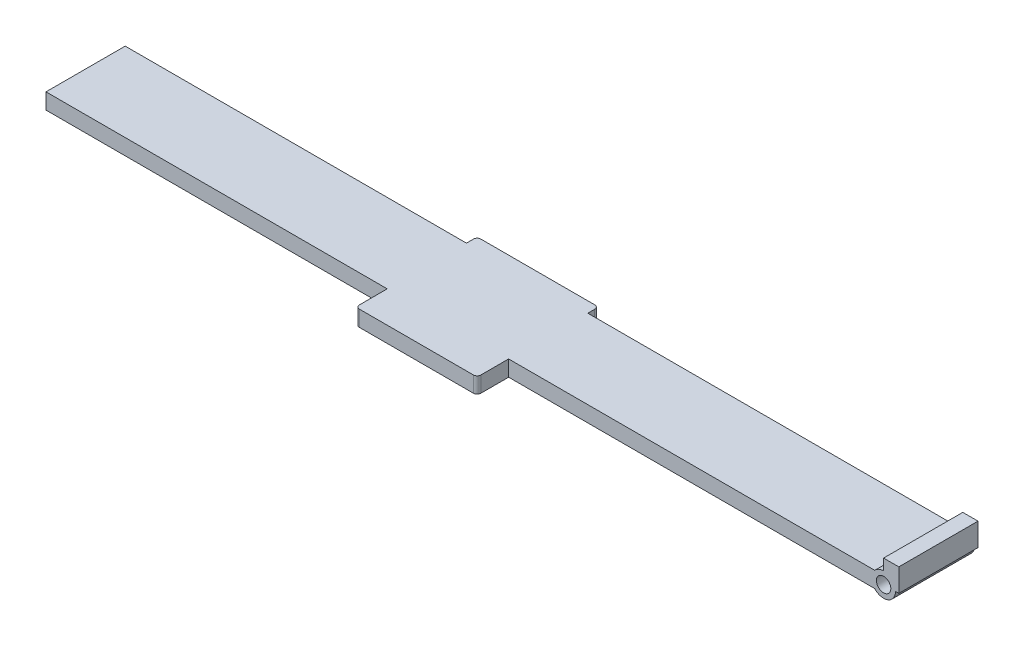
ISO-10303-21;
HEADER;
FILE_DESCRIPTION(('STEP AP214'),'2;1');
FILE_NAME('part.step','',(''),(''),'','','');
FILE_SCHEMA(('AUTOMOTIVE_DESIGN { 1 0 10303 214 1 1 1 1 }'));
ENDSEC;
DATA;
#1=APPLICATION_CONTEXT('core data for automotive mechanical design processes');
#2=APPLICATION_PROTOCOL_DEFINITION('international standard','automotive_design',2000,#1);
#3=PRODUCT_CONTEXT('',#1,'mechanical');
#4=PRODUCT('Part','Part','',(#3));
#5=PRODUCT_RELATED_PRODUCT_CATEGORY('part','',(#4));
#6=PRODUCT_DEFINITION_FORMATION('','',#4);
#7=PRODUCT_DEFINITION_CONTEXT('part definition',#1,'design');
#8=PRODUCT_DEFINITION('design','',#6,#7);
#9=PRODUCT_DEFINITION_SHAPE('','',#8);
#10=(LENGTH_UNIT() NAMED_UNIT(*) SI_UNIT(.MILLI.,.METRE.));
#11=(NAMED_UNIT(*) PLANE_ANGLE_UNIT() SI_UNIT($,.RADIAN.));
#12=(NAMED_UNIT(*) SI_UNIT($,.STERADIAN.) SOLID_ANGLE_UNIT());
#13=UNCERTAINTY_MEASURE_WITH_UNIT(LENGTH_MEASURE(1.E-05),#10,'distance_accuracy_value','');
#14=(GEOMETRIC_REPRESENTATION_CONTEXT(3) GLOBAL_UNCERTAINTY_ASSIGNED_CONTEXT((#13)) GLOBAL_UNIT_ASSIGNED_CONTEXT((#10,
#11,#12)) REPRESENTATION_CONTEXT('',''));
#15=CARTESIAN_POINT('',(0.,0.,0.));
#16=DIRECTION('',(0.,0.,1.));
#17=DIRECTION('',(1.,0.,0.));
#18=AXIS2_PLACEMENT_3D('',#15,#16,#17);
#19=CARTESIAN_POINT('',(-264.4,10.,-25.));
#20=DIRECTION('',(0.,0.,1.));
#21=DIRECTION('',(1.,0.,0.));
#22=AXIS2_PLACEMENT_3D('',#19,#20,#21);
#23=PLANE('',#22);
#24=DIRECTION('',(0.,1.,0.));
#25=VECTOR('',#24,1.);
#26=CARTESIAN_POINT('',(-48.9686518027685,9.99999999999987,-25.));
#27=LINE('',#26,#25);
#28=CARTESIAN_POINT('',(-48.9686518027685,0.,-25.));
#29=VERTEX_POINT('',#28);
#30=CARTESIAN_POINT('',(-48.9686518027685,10.,-25.));
#31=VERTEX_POINT('',#30);
#32=EDGE_CURVE('E213',#29,#31,#27,.T.);
#33=ORIENTED_EDGE('',*,*,#32,.F.);
#34=DIRECTION('',(-1.,0.,0.));
#35=VECTOR('',#34,1.);
#36=CARTESIAN_POINT('',(-264.4,0.,-25.));
#37=LINE('',#36,#35);
#38=CARTESIAN_POINT('',(-264.4,0.,-25.));
#39=VERTEX_POINT('',#38);
#40=EDGE_CURVE('E299',#29,#39,#37,.T.);
#41=ORIENTED_EDGE('',*,*,#40,.T.);
#42=DIRECTION('',(0.,-1.,0.));
#43=VECTOR('',#42,1.);
#44=CARTESIAN_POINT('',(-264.4,10.,-25.));
#45=LINE('',#44,#43);
#46=CARTESIAN_POINT('',(-264.4,10.,-25.));
#47=VERTEX_POINT('',#46);
#48=EDGE_CURVE('E322',#47,#39,#45,.T.);
#49=ORIENTED_EDGE('',*,*,#48,.F.);
#50=DIRECTION('',(-1.,0.,0.));
#51=VECTOR('',#50,1.);
#52=CARTESIAN_POINT('',(-264.4,10.,-25.));
#53=LINE('',#52,#51);
#54=EDGE_CURVE('E55',#31,#47,#53,.T.);
#55=ORIENTED_EDGE('',*,*,#54,.F.);
#56=EDGE_LOOP('',(#33,#41,#49,#55));
#57=FACE_BOUND('',#56,.T.);
#58=ADVANCED_FACE('F38',(#57),#23,.F.);
#59=CARTESIAN_POINT('',(264.4,5.,-25.));
#60=DIRECTION('',(0.,0.,1.));
#61=DIRECTION('',(1.,0.,0.));
#62=AXIS2_PLACEMENT_3D('',#59,#60,#61);
#63=CIRCLE('',#62,4.550175819669);
#64=CARTESIAN_POINT('',(268.950175819669,5.,-25.));
#65=VERTEX_POINT('',#64);
#66=EDGE_CURVE('E256',#65,#65,#63,.T.);
#67=ORIENTED_EDGE('',*,*,#66,.T.);
#68=EDGE_LOOP('',(#67));
#69=FACE_BOUND('',#68,.T.);
#70=DIRECTION('',(0.,-1.,0.));
#71=VECTOR('',#70,1.);
#72=CARTESIAN_POINT('',(27.6731416146017,9.99999999999983,-25.));
#73=LINE('',#72,#71);
#74=CARTESIAN_POINT('',(27.6731416146017,10.,-25.));
#75=VERTEX_POINT('',#74);
#76=CARTESIAN_POINT('',(27.6731416146017,0.,-25.));
#77=VERTEX_POINT('',#76);
#78=EDGE_CURVE('E66',#75,#77,#73,.T.);
#79=ORIENTED_EDGE('',*,*,#78,.F.);
#80=CARTESIAN_POINT('',(258.809830056251,10.,-25.));
#81=VERTEX_POINT('',#80);
#82=EDGE_CURVE('E300',#81,#75,#53,.T.);
#83=ORIENTED_EDGE('',*,*,#82,.F.);
#84=CARTESIAN_POINT('',(264.4,5.,-25.));
#85=DIRECTION('',(0.,0.,1.));
#86=DIRECTION('',(1.,0.,0.));
#87=AXIS2_PLACEMENT_3D('',#84,#85,#86);
#88=CIRCLE('',#87,7.50000000000001);
#89=CARTESIAN_POINT('',(264.4,12.5,-25.));
#90=VERTEX_POINT('',#89);
#91=EDGE_CURVE('E293',#90,#81,#88,.T.);
#92=ORIENTED_EDGE('',*,*,#91,.F.);
#93=DIRECTION('',(0.,-1.,0.));
#94=VECTOR('',#93,1.);
#95=CARTESIAN_POINT('',(264.4,5.,-25.));
#96=LINE('',#95,#94);
#97=CARTESIAN_POINT('',(264.4,19.4847999275538,-25.));
#98=VERTEX_POINT('',#97);
#99=EDGE_CURVE('E262',#98,#90,#96,.T.);
#100=ORIENTED_EDGE('',*,*,#99,.F.);
#101=DIRECTION('',(-1.,0.,0.));
#102=VECTOR('',#101,1.);
#103=CARTESIAN_POINT('',(264.4,19.4847999275538,-25.));
#104=LINE('',#103,#102);
#105=CARTESIAN_POINT('',(273.999831792985,19.4847999275538,-25.));
#106=VERTEX_POINT('',#105);
#107=EDGE_CURVE('E270',#106,#98,#104,.T.);
#108=ORIENTED_EDGE('',*,*,#107,.F.);
#109=DIRECTION('',(0.,1.,0.));
#110=VECTOR('',#109,1.);
#111=CARTESIAN_POINT('',(273.999831792985,5.,-25.));
#112=LINE('',#111,#110);
#113=CARTESIAN_POINT('',(273.999831792985,5.,-25.));
#114=VERTEX_POINT('',#113);
#115=EDGE_CURVE('E267',#114,#106,#112,.T.);
#116=ORIENTED_EDGE('',*,*,#115,.F.);
#117=DIRECTION('',(1.,0.,0.));
#118=VECTOR('',#117,1.);
#119=CARTESIAN_POINT('',(264.4,5.,-25.));
#120=LINE('',#119,#118);
#121=CARTESIAN_POINT('',(271.9,5.,-25.));
#122=VERTEX_POINT('',#121);
#123=EDGE_CURVE('E264',#122,#114,#120,.T.);
#124=ORIENTED_EDGE('',*,*,#123,.F.);
#125=CARTESIAN_POINT('',(258.809830056251,0.,-25.));
#126=VERTEX_POINT('',#125);
#127=EDGE_CURVE('E289',#126,#122,#88,.T.);
#128=ORIENTED_EDGE('',*,*,#127,.F.);
#129=EDGE_CURVE('E311',#126,#77,#37,.T.);
#130=ORIENTED_EDGE('',*,*,#129,.T.);
#131=EDGE_LOOP('',(#79,#83,#92,#100,#108,#116,#124,#128,#130));
#132=FACE_BOUND('',#131,.T.);
#133=ADVANCED_FACE('F335',(#69,#132),#23,.F.);
#134=CARTESIAN_POINT('',(-264.4,10.,25.));
#135=DIRECTION('',(0.,0.,-1.));
#136=DIRECTION('',(-1.,0.,0.));
#137=AXIS2_PLACEMENT_3D('',#134,#135,#136);
#138=PLANE('',#137);
#139=DIRECTION('',(0.,-1.,0.));
#140=VECTOR('',#139,1.);
#141=CARTESIAN_POINT('',(-48.9686518027685,9.99999999999987,25.));
#142=LINE('',#141,#140);
#143=CARTESIAN_POINT('',(-48.9686518027685,10.,25.));
#144=VERTEX_POINT('',#143);
#145=CARTESIAN_POINT('',(-48.9686518027685,0.,25.));
#146=VERTEX_POINT('',#145);
#147=EDGE_CURVE('E249',#144,#146,#142,.T.);
#148=ORIENTED_EDGE('',*,*,#147,.F.);
#149=DIRECTION('',(1.,0.,0.));
#150=VECTOR('',#149,1.);
#151=CARTESIAN_POINT('',(-264.4,10.,25.));
#152=LINE('',#151,#150);
#153=CARTESIAN_POINT('',(-264.4,10.,25.));
#154=VERTEX_POINT('',#153);
#155=EDGE_CURVE('E306',#154,#144,#152,.T.);
#156=ORIENTED_EDGE('',*,*,#155,.F.);
#157=DIRECTION('',(0.,-1.,0.));
#158=VECTOR('',#157,1.);
#159=CARTESIAN_POINT('',(-264.4,10.,25.));
#160=LINE('',#159,#158);
#161=CARTESIAN_POINT('',(-264.4,0.,25.));
#162=VERTEX_POINT('',#161);
#163=EDGE_CURVE('E310',#154,#162,#160,.T.);
#164=ORIENTED_EDGE('',*,*,#163,.T.);
#165=DIRECTION('',(1.,0.,0.));
#166=VECTOR('',#165,1.);
#167=CARTESIAN_POINT('',(-264.4,0.,25.));
#168=LINE('',#167,#166);
#169=EDGE_CURVE('E317',#162,#146,#168,.T.);
#170=ORIENTED_EDGE('',*,*,#169,.T.);
#171=EDGE_LOOP('',(#148,#156,#164,#170));
#172=FACE_BOUND('',#171,.T.);
#173=ADVANCED_FACE('F488',(#172),#138,.F.);
#174=CARTESIAN_POINT('',(264.4,5.,25.));
#175=DIRECTION('',(0.,0.,1.));
#176=DIRECTION('',(1.,0.,0.));
#177=AXIS2_PLACEMENT_3D('',#174,#175,#176);
#178=CIRCLE('',#177,4.550175819669);
#179=CARTESIAN_POINT('',(268.950175819669,5.,25.));
#180=VERTEX_POINT('',#179);
#181=EDGE_CURVE('E255',#180,#180,#178,.T.);
#182=ORIENTED_EDGE('',*,*,#181,.F.);
#183=EDGE_LOOP('',(#182));
#184=FACE_BOUND('',#183,.T.);
#185=DIRECTION('',(0.,1.,0.));
#186=VECTOR('',#185,1.);
#187=CARTESIAN_POINT('',(27.6731416146017,9.99999999999983,25.));
#188=LINE('',#187,#186);
#189=CARTESIAN_POINT('',(27.6731416146017,0.,25.));
#190=VERTEX_POINT('',#189);
#191=CARTESIAN_POINT('',(27.6731416146017,10.,25.));
#192=VERTEX_POINT('',#191);
#193=EDGE_CURVE('E234',#190,#192,#188,.T.);
#194=ORIENTED_EDGE('',*,*,#193,.F.);
#195=CARTESIAN_POINT('',(258.809830056251,0.,25.));
#196=VERTEX_POINT('',#195);
#197=EDGE_CURVE('E316',#190,#196,#168,.T.);
#198=ORIENTED_EDGE('',*,*,#197,.T.);
#199=CARTESIAN_POINT('',(264.4,5.,25.));
#200=DIRECTION('',(0.,0.,1.));
#201=DIRECTION('',(1.,0.,0.));
#202=AXIS2_PLACEMENT_3D('',#199,#200,#201);
#203=CIRCLE('',#202,7.50000000000001);
#204=CARTESIAN_POINT('',(271.9,5.,25.));
#205=VERTEX_POINT('',#204);
#206=EDGE_CURVE('E294',#196,#205,#203,.T.);
#207=ORIENTED_EDGE('',*,*,#206,.T.);
#208=DIRECTION('',(1.,0.,0.));
#209=VECTOR('',#208,1.);
#210=CARTESIAN_POINT('',(264.4,5.,25.));
#211=LINE('',#210,#209);
#212=CARTESIAN_POINT('',(273.999831792985,5.,25.));
#213=VERTEX_POINT('',#212);
#214=EDGE_CURVE('E275',#205,#213,#211,.T.);
#215=ORIENTED_EDGE('',*,*,#214,.T.);
#216=DIRECTION('',(0.,1.,0.));
#217=VECTOR('',#216,1.);
#218=CARTESIAN_POINT('',(273.999831792985,5.,25.));
#219=LINE('',#218,#217);
#220=CARTESIAN_POINT('',(273.999831792985,19.4847999275538,25.));
#221=VERTEX_POINT('',#220);
#222=EDGE_CURVE('E277',#213,#221,#219,.T.);
#223=ORIENTED_EDGE('',*,*,#222,.T.);
#224=DIRECTION('',(-1.,0.,0.));
#225=VECTOR('',#224,1.);
#226=CARTESIAN_POINT('',(264.4,19.4847999275538,25.));
#227=LINE('',#226,#225);
#228=CARTESIAN_POINT('',(264.4,19.4847999275538,25.));
#229=VERTEX_POINT('',#228);
#230=EDGE_CURVE('E265',#221,#229,#227,.T.);
#231=ORIENTED_EDGE('',*,*,#230,.T.);
#232=DIRECTION('',(0.,-1.,0.));
#233=VECTOR('',#232,1.);
#234=CARTESIAN_POINT('',(264.4,5.,25.));
#235=LINE('',#234,#233);
#236=CARTESIAN_POINT('',(264.4,12.5,25.));
#237=VERTEX_POINT('',#236);
#238=EDGE_CURVE('E259',#229,#237,#235,.T.);
#239=ORIENTED_EDGE('',*,*,#238,.T.);
#240=CARTESIAN_POINT('',(258.809830056251,10.,25.));
#241=VERTEX_POINT('',#240);
#242=EDGE_CURVE('E284',#237,#241,#203,.T.);
#243=ORIENTED_EDGE('',*,*,#242,.T.);
#244=EDGE_CURVE('E305',#192,#241,#152,.T.);
#245=ORIENTED_EDGE('',*,*,#244,.F.);
#246=EDGE_LOOP('',(#194,#198,#207,#215,#223,#231,#239,#243,#245));
#247=FACE_BOUND('',#246,.T.);
#248=ADVANCED_FACE('F430',(#184,#247),#138,.F.);
#249=CARTESIAN_POINT('',(264.4,5.,-25.));
#250=DIRECTION('',(0.,0.,1.));
#251=DIRECTION('',(1.,0.,0.));
#252=AXIS2_PLACEMENT_3D('',#249,#250,#251);
#253=CYLINDRICAL_SURFACE('',#252,7.50000000000001);
#254=DIRECTION('',(0.,0.,1.));
#255=VECTOR('',#254,1.);
#256=CARTESIAN_POINT('',(264.4,12.5,-25.));
#257=LINE('',#256,#255);
#258=EDGE_CURVE('E11',#90,#237,#257,.T.);
#259=ORIENTED_EDGE('',*,*,#258,.F.);
#260=ORIENTED_EDGE('',*,*,#91,.T.);
#261=DIRECTION('',(0.,0.,1.));
#262=VECTOR('',#261,1.);
#263=CARTESIAN_POINT('',(258.809830056251,10.,-25.));
#264=LINE('',#263,#262);
#265=EDGE_CURVE('E292',#241,#81,#264,.F.);
#266=ORIENTED_EDGE('',*,*,#265,.F.);
#267=ORIENTED_EDGE('',*,*,#242,.F.);
#268=EDGE_LOOP('',(#259,#260,#266,#267));
#269=FACE_BOUND('',#268,.T.);
#270=ADVANCED_FACE('F434',(#269),#253,.T.);
#271=CARTESIAN_POINT('',(-264.4,10.,25.));
#272=DIRECTION('',(1.,0.,0.));
#273=DIRECTION('',(0.,0.,-1.));
#274=AXIS2_PLACEMENT_3D('',#271,#272,#273);
#275=PLANE('',#274);
#276=DIRECTION('',(0.,0.,1.));
#277=VECTOR('',#276,1.);
#278=CARTESIAN_POINT('',(-264.4,0.,25.));
#279=LINE('',#278,#277);
#280=EDGE_CURVE('E314',#39,#162,#279,.T.);
#281=ORIENTED_EDGE('',*,*,#280,.T.);
#282=ORIENTED_EDGE('',*,*,#163,.F.);
#283=DIRECTION('',(0.,0.,1.));
#284=VECTOR('',#283,1.);
#285=CARTESIAN_POINT('',(-264.4,10.,25.));
#286=LINE('',#285,#284);
#287=EDGE_CURVE('E303',#47,#154,#286,.T.);
#288=ORIENTED_EDGE('',*,*,#287,.F.);
#289=ORIENTED_EDGE('',*,*,#48,.T.);
#290=EDGE_LOOP('',(#281,#282,#288,#289));
#291=FACE_BOUND('',#290,.T.);
#292=ADVANCED_FACE('F506',(#291),#275,.F.);
#293=CARTESIAN_POINT('',(264.4,10.,-25.));
#294=DIRECTION('',(0.,-1.,0.));
#295=DIRECTION('',(0.,0.,-1.));
#296=AXIS2_PLACEMENT_3D('',#293,#294,#295);
#297=PLANE('',#296);
#298=ORIENTED_EDGE('',*,*,#82,.T.);
#299=DIRECTION('',(0.,0.,-1.));
#300=VECTOR('',#299,1.);
#301=CARTESIAN_POINT('',(27.6731416146017,9.99999999999998,42.4540909486958));
#302=LINE('',#301,#300);
#303=CARTESIAN_POINT('',(27.6731416146017,9.99999999999998,-29.3464263479888));
#304=VERTEX_POINT('',#303);
#305=EDGE_CURVE('E352',#75,#304,#302,.T.);
#306=ORIENTED_EDGE('',*,*,#305,.T.);
#307=CARTESIAN_POINT('',(24.4757651634344,9.99999999999999,-28.5696879571643));
#308=DIRECTION('',(0.,1.,0.));
#309=DIRECTION('',(0.707106781186548,0.,-0.707106781186548));
#310=AXIS2_PLACEMENT_3D('',#307,#308,#309);
#311=ELLIPSE('',#310,3.56465162533727,2.78203003774932);
#312=CARTESIAN_POINT('',(25.2525035542589,9.99999999999998,-31.7670644083316));
#313=VERTEX_POINT('',#312);
#314=EDGE_CURVE('E363',#304,#313,#311,.T.);
#315=ORIENTED_EDGE('',*,*,#314,.T.);
#316=DIRECTION('',(-1.,0.,0.));
#317=VECTOR('',#316,1.);
#318=CARTESIAN_POINT('',(25.2525035542589,9.99999999999998,-31.7670644083316));
#319=LINE('',#318,#317);
#320=CARTESIAN_POINT('',(-46.5480137424257,10.,-31.7670644083316));
#321=VERTEX_POINT('',#320);
#322=EDGE_CURVE('E223',#313,#321,#319,.T.);
#323=ORIENTED_EDGE('',*,*,#322,.T.);
#324=CARTESIAN_POINT('',(-45.7712753516011,10.,-28.5696879571643));
#325=DIRECTION('',(0.,1.,0.));
#326=DIRECTION('',(-0.707106781186548,0.,-0.707106781186547));
#327=AXIS2_PLACEMENT_3D('',#324,#325,#326);
#328=ELLIPSE('',#327,3.56465162533727,2.78203003774931);
#329=CARTESIAN_POINT('',(-48.9686518027685,10.,-29.3464263479888));
#330=VERTEX_POINT('',#329);
#331=EDGE_CURVE('E220',#321,#330,#328,.T.);
#332=ORIENTED_EDGE('',*,*,#331,.T.);
#333=DIRECTION('',(0.,0.,1.));
#334=VECTOR('',#333,1.);
#335=CARTESIAN_POINT('',(-48.9686518027685,10.,-29.3464263479888));
#336=LINE('',#335,#334);
#337=EDGE_CURVE('E206',#330,#31,#336,.T.);
#338=ORIENTED_EDGE('',*,*,#337,.T.);
#339=ORIENTED_EDGE('',*,*,#54,.T.);
#340=ORIENTED_EDGE('',*,*,#287,.T.);
#341=ORIENTED_EDGE('',*,*,#155,.T.);
#342=CARTESIAN_POINT('',(-48.9686518027685,10.,42.4540909486958));
#343=VERTEX_POINT('',#342);
#344=EDGE_CURVE('E217',#144,#343,#336,.T.);
#345=ORIENTED_EDGE('',*,*,#344,.T.);
#346=CARTESIAN_POINT('',(-45.7712753516011,10.,41.6773525578712));
#347=DIRECTION('',(0.,1.,0.));
#348=DIRECTION('',(-0.707106781186549,0.,0.707106781186547));
#349=AXIS2_PLACEMENT_3D('',#346,#347,#348);
#350=ELLIPSE('',#349,3.56465162533727,2.78203003774932);
#351=CARTESIAN_POINT('',(-46.5480137424257,10.,44.8747290090386));
#352=VERTEX_POINT('',#351);
#353=EDGE_CURVE('E216',#343,#352,#350,.T.);
#354=ORIENTED_EDGE('',*,*,#353,.T.);
#355=DIRECTION('',(1.,0.,0.));
#356=VECTOR('',#355,1.);
#357=CARTESIAN_POINT('',(-46.5480137424257,10.,44.8747290090386));
#358=LINE('',#357,#356);
#359=CARTESIAN_POINT('',(25.2525035542589,9.99999999999998,44.8747290090386));
#360=VERTEX_POINT('',#359);
#361=EDGE_CURVE('E365',#352,#360,#358,.T.);
#362=ORIENTED_EDGE('',*,*,#361,.T.);
#363=CARTESIAN_POINT('',(24.4757651634344,9.99999999999999,41.6773525578712));
#364=DIRECTION('',(0.,1.,0.));
#365=DIRECTION('',(0.707106781186548,0.,0.707106781186547));
#366=AXIS2_PLACEMENT_3D('',#363,#364,#365);
#367=ELLIPSE('',#366,3.56465162533726,2.78203003774932);
#368=CARTESIAN_POINT('',(27.6731416146017,9.99999999999998,42.4540909486958));
#369=VERTEX_POINT('',#368);
#370=EDGE_CURVE('E357',#360,#369,#367,.T.);
#371=ORIENTED_EDGE('',*,*,#370,.T.);
#372=EDGE_CURVE('E356',#369,#192,#302,.T.);
#373=ORIENTED_EDGE('',*,*,#372,.T.);
#374=ORIENTED_EDGE('',*,*,#244,.T.);
#375=ORIENTED_EDGE('',*,*,#265,.T.);
#376=EDGE_LOOP('',(#298,#306,#315,#323,#332,#338,#339,#340,#341,#345,#354,#362,#371,#373,#374,#375));
#377=FACE_BOUND('',#376,.T.);
#378=ADVANCED_FACE('F221',(#377),#297,.F.);
#379=CARTESIAN_POINT('',(264.4,0.,-25.));
#380=DIRECTION('',(0.,-1.,0.));
#381=DIRECTION('',(0.,0.,-1.));
#382=AXIS2_PLACEMENT_3D('',#379,#380,#381);
#383=PLANE('',#382);
#384=ORIENTED_EDGE('',*,*,#197,.F.);
#385=DIRECTION('',(0.,0.,-1.));
#386=VECTOR('',#385,1.);
#387=CARTESIAN_POINT('',(27.6731416146017,0.,42.4540909486958));
#388=LINE('',#387,#386);
#389=CARTESIAN_POINT('',(27.6731416146017,0.,42.4540909486958));
#390=VERTEX_POINT('',#389);
#391=EDGE_CURVE('E454',#390,#190,#388,.T.);
#392=ORIENTED_EDGE('',*,*,#391,.F.);
#393=CARTESIAN_POINT('',(24.4757651634344,0.,41.6773525578712));
#394=DIRECTION('',(0.,1.,0.));
#395=DIRECTION('',(0.707106781186548,0.,0.707106781186547));
#396=AXIS2_PLACEMENT_3D('',#393,#394,#395);
#397=ELLIPSE('',#396,3.56465162533726,2.78203003774932);
#398=CARTESIAN_POINT('',(25.2525035542589,0.,44.8747290090386));
#399=VERTEX_POINT('',#398);
#400=EDGE_CURVE('E420',#399,#390,#397,.T.);
#401=ORIENTED_EDGE('',*,*,#400,.F.);
#402=DIRECTION('',(1.,0.,0.));
#403=VECTOR('',#402,1.);
#404=CARTESIAN_POINT('',(-46.5480137424257,0.,44.8747290090386));
#405=LINE('',#404,#403);
#406=CARTESIAN_POINT('',(-46.5480137424257,0.,44.8747290090386));
#407=VERTEX_POINT('',#406);
#408=EDGE_CURVE('E413',#407,#399,#405,.T.);
#409=ORIENTED_EDGE('',*,*,#408,.F.);
#410=CARTESIAN_POINT('',(-45.7712753516011,0.,41.6773525578712));
#411=DIRECTION('',(0.,1.,0.));
#412=DIRECTION('',(-0.707106781186549,0.,0.707106781186547));
#413=AXIS2_PLACEMENT_3D('',#410,#411,#412);
#414=ELLIPSE('',#413,3.56465162533727,2.78203003774932);
#415=CARTESIAN_POINT('',(-48.9686518027685,0.,42.4540909486958));
#416=VERTEX_POINT('',#415);
#417=EDGE_CURVE('E447',#416,#407,#414,.T.);
#418=ORIENTED_EDGE('',*,*,#417,.F.);
#419=DIRECTION('',(0.,0.,1.));
#420=VECTOR('',#419,1.);
#421=CARTESIAN_POINT('',(-48.9686518027685,0.,-29.3464263479888));
#422=LINE('',#421,#420);
#423=EDGE_CURVE('E473',#146,#416,#422,.T.);
#424=ORIENTED_EDGE('',*,*,#423,.F.);
#425=ORIENTED_EDGE('',*,*,#169,.F.);
#426=ORIENTED_EDGE('',*,*,#280,.F.);
#427=ORIENTED_EDGE('',*,*,#40,.F.);
#428=CARTESIAN_POINT('',(-48.9686518027685,0.,-29.3464263479888));
#429=VERTEX_POINT('',#428);
#430=EDGE_CURVE('E450',#429,#29,#422,.T.);
#431=ORIENTED_EDGE('',*,*,#430,.F.);
#432=CARTESIAN_POINT('',(-45.7712753516011,0.,-28.5696879571643));
#433=DIRECTION('',(0.,1.,0.));
#434=DIRECTION('',(-0.707106781186548,0.,-0.707106781186547));
#435=AXIS2_PLACEMENT_3D('',#432,#433,#434);
#436=ELLIPSE('',#435,3.56465162533727,2.78203003774931);
#437=CARTESIAN_POINT('',(-46.5480137424257,0.,-31.7670644083316));
#438=VERTEX_POINT('',#437);
#439=EDGE_CURVE('E232',#438,#429,#436,.T.);
#440=ORIENTED_EDGE('',*,*,#439,.F.);
#441=DIRECTION('',(-1.,0.,0.));
#442=VECTOR('',#441,1.);
#443=CARTESIAN_POINT('',(25.2525035542589,0.,-31.7670644083316));
#444=LINE('',#443,#442);
#445=CARTESIAN_POINT('',(25.2525035542589,0.,-31.7670644083316));
#446=VERTEX_POINT('',#445);
#447=EDGE_CURVE('E228',#446,#438,#444,.T.);
#448=ORIENTED_EDGE('',*,*,#447,.F.);
#449=CARTESIAN_POINT('',(24.4757651634344,0.,-28.5696879571643));
#450=DIRECTION('',(0.,1.,0.));
#451=DIRECTION('',(0.707106781186548,0.,-0.707106781186548));
#452=AXIS2_PLACEMENT_3D('',#449,#450,#451);
#453=ELLIPSE('',#452,3.56465162533727,2.78203003774932);
#454=CARTESIAN_POINT('',(27.6731416146017,0.,-29.3464263479888));
#455=VERTEX_POINT('',#454);
#456=EDGE_CURVE('E456',#455,#446,#453,.T.);
#457=ORIENTED_EDGE('',*,*,#456,.F.);
#458=EDGE_CURVE('E346',#77,#455,#388,.T.);
#459=ORIENTED_EDGE('',*,*,#458,.F.);
#460=ORIENTED_EDGE('',*,*,#129,.F.);
#461=DIRECTION('',(0.,0.,1.));
#462=VECTOR('',#461,1.);
#463=CARTESIAN_POINT('',(258.809830056251,0.,-25.));
#464=LINE('',#463,#462);
#465=EDGE_CURVE('E325',#196,#126,#464,.F.);
#466=ORIENTED_EDGE('',*,*,#465,.F.);
#467=EDGE_LOOP('',(#384,#392,#401,#409,#418,#424,#425,#426,#427,#431,#440,#448,#457,#459,#460,#466));
#468=FACE_BOUND('',#467,.T.);
#469=ADVANCED_FACE('F341',(#468),#383,.T.);
#470=DIRECTION('',(0.,0.,1.));
#471=VECTOR('',#470,1.);
#472=CARTESIAN_POINT('',(271.9,5.,-25.));
#473=LINE('',#472,#471);
#474=EDGE_CURVE('E45',#205,#122,#473,.F.);
#475=ORIENTED_EDGE('',*,*,#474,.F.);
#476=ORIENTED_EDGE('',*,*,#206,.F.);
#477=ORIENTED_EDGE('',*,*,#465,.T.);
#478=ORIENTED_EDGE('',*,*,#127,.T.);
#479=EDGE_LOOP('',(#475,#476,#477,#478));
#480=FACE_BOUND('',#479,.T.);
#481=ADVANCED_FACE('F338',(#480),#253,.T.);
#482=CARTESIAN_POINT('',(264.4,5.,-25.));
#483=DIRECTION('',(-1.,0.,0.));
#484=DIRECTION('',(0.,0.,1.));
#485=AXIS2_PLACEMENT_3D('',#482,#483,#484);
#486=PLANE('',#485);
#487=ORIENTED_EDGE('',*,*,#99,.T.);
#488=ORIENTED_EDGE('',*,*,#258,.T.);
#489=ORIENTED_EDGE('',*,*,#238,.F.);
#490=DIRECTION('',(0.,0.,1.));
#491=VECTOR('',#490,1.);
#492=CARTESIAN_POINT('',(264.4,19.4847999275538,-25.));
#493=LINE('',#492,#491);
#494=EDGE_CURVE('E282',#98,#229,#493,.T.);
#495=ORIENTED_EDGE('',*,*,#494,.F.);
#496=EDGE_LOOP('',(#487,#488,#489,#495));
#497=FACE_BOUND('',#496,.T.);
#498=ADVANCED_FACE('F524',(#497),#486,.T.);
#499=CARTESIAN_POINT('',(264.4,19.4847999275538,-25.));
#500=DIRECTION('',(0.,1.,0.));
#501=DIRECTION('',(-1.,0.,0.));
#502=AXIS2_PLACEMENT_3D('',#499,#500,#501);
#503=PLANE('',#502);
#504=ORIENTED_EDGE('',*,*,#230,.F.);
#505=DIRECTION('',(0.,0.,1.));
#506=VECTOR('',#505,1.);
#507=CARTESIAN_POINT('',(273.999831792985,19.4847999275538,-25.));
#508=LINE('',#507,#506);
#509=EDGE_CURVE('E285',#106,#221,#508,.T.);
#510=ORIENTED_EDGE('',*,*,#509,.F.);
#511=ORIENTED_EDGE('',*,*,#107,.T.);
#512=ORIENTED_EDGE('',*,*,#494,.T.);
#513=EDGE_LOOP('',(#504,#510,#511,#512));
#514=FACE_BOUND('',#513,.T.);
#515=ADVANCED_FACE('F440',(#514),#503,.T.);
#516=CARTESIAN_POINT('',(273.999831792985,5.,-25.));
#517=DIRECTION('',(1.,0.,0.));
#518=DIRECTION('',(0.,0.,-1.));
#519=AXIS2_PLACEMENT_3D('',#516,#517,#518);
#520=PLANE('',#519);
#521=ORIENTED_EDGE('',*,*,#222,.F.);
#522=DIRECTION('',(0.,0.,1.));
#523=VECTOR('',#522,1.);
#524=CARTESIAN_POINT('',(273.999831792985,5.,-25.));
#525=LINE('',#524,#523);
#526=EDGE_CURVE('E273',#114,#213,#525,.T.);
#527=ORIENTED_EDGE('',*,*,#526,.F.);
#528=ORIENTED_EDGE('',*,*,#115,.T.);
#529=ORIENTED_EDGE('',*,*,#509,.T.);
#530=EDGE_LOOP('',(#521,#527,#528,#529));
#531=FACE_BOUND('',#530,.T.);
#532=ADVANCED_FACE('F443',(#531),#520,.T.);
#533=CARTESIAN_POINT('',(264.4,5.,-25.));
#534=DIRECTION('',(0.,-1.,0.));
#535=DIRECTION('',(0.,0.,-1.));
#536=AXIS2_PLACEMENT_3D('',#533,#534,#535);
#537=PLANE('',#536);
#538=ORIENTED_EDGE('',*,*,#214,.F.);
#539=ORIENTED_EDGE('',*,*,#474,.T.);
#540=ORIENTED_EDGE('',*,*,#123,.T.);
#541=ORIENTED_EDGE('',*,*,#526,.T.);
#542=EDGE_LOOP('',(#538,#539,#540,#541));
#543=FACE_BOUND('',#542,.T.);
#544=ADVANCED_FACE('F329',(#543),#537,.T.);
#545=CARTESIAN_POINT('',(264.4,5.,-25.));
#546=DIRECTION('',(0.,0.,1.));
#547=DIRECTION('',(1.,0.,0.));
#548=AXIS2_PLACEMENT_3D('',#545,#546,#547);
#549=CYLINDRICAL_SURFACE('',#548,4.550175819669);
#550=ORIENTED_EDGE('',*,*,#66,.F.);
#551=EDGE_LOOP('',(#550));
#552=FACE_BOUND('',#551,.T.);
#553=ORIENTED_EDGE('',*,*,#181,.T.);
#554=EDGE_LOOP('',(#553));
#555=FACE_BOUND('',#554,.T.);
#556=ADVANCED_FACE('F396',(#552,#555),#549,.F.);
#557=DIRECTION('',(0.,-1.,0.));
#558=VECTOR('',#557,1.);
#559=SURFACE_OF_LINEAR_EXTRUSION('',#350,#558);
#560=ORIENTED_EDGE('',*,*,#417,.T.);
#561=DIRECTION('',(0.,-1.,0.));
#562=VECTOR('',#561,1.);
#563=CARTESIAN_POINT('',(-46.5480137424257,10.,44.8747290090386));
#564=LINE('',#563,#562);
#565=EDGE_CURVE('E243',#352,#407,#564,.T.);
#566=ORIENTED_EDGE('',*,*,#565,.F.);
#567=ORIENTED_EDGE('',*,*,#353,.F.);
#568=DIRECTION('',(0.,-1.,0.));
#569=VECTOR('',#568,1.);
#570=CARTESIAN_POINT('',(-48.9686518027685,10.,42.4540909486958));
#571=LINE('',#570,#569);
#572=EDGE_CURVE('E235',#343,#416,#571,.T.);
#573=ORIENTED_EDGE('',*,*,#572,.T.);
#574=EDGE_LOOP('',(#560,#566,#567,#573));
#575=FACE_BOUND('',#574,.T.);
#576=ADVANCED_FACE('F391',(#575),#559,.F.);
#577=CARTESIAN_POINT('',(-46.5480137424257,10.,44.8747290090386));
#578=DIRECTION('',(0.,0.,-1.));
#579=DIRECTION('',(0.,1.,0.));
#580=AXIS2_PLACEMENT_3D('',#577,#578,#579);
#581=PLANE('',#580);
#582=ORIENTED_EDGE('',*,*,#408,.T.);
#583=DIRECTION('',(0.,-1.,0.));
#584=VECTOR('',#583,1.);
#585=CARTESIAN_POINT('',(25.2525035542589,9.99999999999998,44.8747290090386));
#586=LINE('',#585,#584);
#587=EDGE_CURVE('E411',#360,#399,#586,.T.);
#588=ORIENTED_EDGE('',*,*,#587,.F.);
#589=ORIENTED_EDGE('',*,*,#361,.F.);
#590=ORIENTED_EDGE('',*,*,#565,.T.);
#591=EDGE_LOOP('',(#582,#588,#589,#590));
#592=FACE_BOUND('',#591,.T.);
#593=ADVANCED_FACE('F387',(#592),#581,.F.);
#594=DIRECTION('',(0.,-1.,0.));
#595=VECTOR('',#594,1.);
#596=SURFACE_OF_LINEAR_EXTRUSION('',#367,#595);
#597=ORIENTED_EDGE('',*,*,#400,.T.);
#598=DIRECTION('',(0.,-1.,0.));
#599=VECTOR('',#598,1.);
#600=CARTESIAN_POINT('',(27.6731416146017,9.99999999999998,42.4540909486958));
#601=LINE('',#600,#599);
#602=EDGE_CURVE('E416',#369,#390,#601,.T.);
#603=ORIENTED_EDGE('',*,*,#602,.F.);
#604=ORIENTED_EDGE('',*,*,#370,.F.);
#605=ORIENTED_EDGE('',*,*,#587,.T.);
#606=EDGE_LOOP('',(#597,#603,#604,#605));
#607=FACE_BOUND('',#606,.T.);
#608=ADVANCED_FACE('F384',(#607),#596,.F.);
#609=CARTESIAN_POINT('',(27.6731416146017,9.99999999999998,42.4540909486958));
#610=DIRECTION('',(-1.,0.,0.));
#611=DIRECTION('',(0.,-1.,0.));
#612=AXIS2_PLACEMENT_3D('',#609,#610,#611);
#613=PLANE('',#612);
#614=ORIENTED_EDGE('',*,*,#391,.T.);
#615=ORIENTED_EDGE('',*,*,#193,.T.);
#616=ORIENTED_EDGE('',*,*,#372,.F.);
#617=ORIENTED_EDGE('',*,*,#602,.T.);
#618=EDGE_LOOP('',(#614,#615,#616,#617));
#619=FACE_BOUND('',#618,.T.);
#620=ADVANCED_FACE('F383',(#619),#613,.F.);
#621=CARTESIAN_POINT('',(-48.9686518027685,10.,-29.3464263479888));
#622=DIRECTION('',(1.,0.,0.));
#623=DIRECTION('',(0.,1.,0.));
#624=AXIS2_PLACEMENT_3D('',#621,#622,#623);
#625=PLANE('',#624);
#626=ORIENTED_EDGE('',*,*,#344,.F.);
#627=ORIENTED_EDGE('',*,*,#147,.T.);
#628=ORIENTED_EDGE('',*,*,#423,.T.);
#629=ORIENTED_EDGE('',*,*,#572,.F.);
#630=EDGE_LOOP('',(#626,#627,#628,#629));
#631=FACE_BOUND('',#630,.T.);
#632=ADVANCED_FACE('F477',(#631),#625,.F.);
#633=ORIENTED_EDGE('',*,*,#430,.T.);
#634=ORIENTED_EDGE('',*,*,#32,.T.);
#635=ORIENTED_EDGE('',*,*,#337,.F.);
#636=DIRECTION('',(0.,-1.,0.));
#637=VECTOR('',#636,1.);
#638=CARTESIAN_POINT('',(-48.9686518027685,10.,-29.3464263479888));
#639=LINE('',#638,#637);
#640=EDGE_CURVE('E211',#330,#429,#639,.T.);
#641=ORIENTED_EDGE('',*,*,#640,.T.);
#642=EDGE_LOOP('',(#633,#634,#635,#641));
#643=FACE_BOUND('',#642,.T.);
#644=ADVANCED_FACE('F209',(#643),#625,.F.);
#645=ORIENTED_EDGE('',*,*,#305,.F.);
#646=ORIENTED_EDGE('',*,*,#78,.T.);
#647=ORIENTED_EDGE('',*,*,#458,.T.);
#648=DIRECTION('',(0.,-1.,0.));
#649=VECTOR('',#648,1.);
#650=CARTESIAN_POINT('',(27.6731416146017,9.99999999999998,-29.3464263479888));
#651=LINE('',#650,#649);
#652=EDGE_CURVE('E353',#304,#455,#651,.T.);
#653=ORIENTED_EDGE('',*,*,#652,.F.);
#654=EDGE_LOOP('',(#645,#646,#647,#653));
#655=FACE_BOUND('',#654,.T.);
#656=ADVANCED_FACE('F349',(#655),#613,.F.);
#657=DIRECTION('',(0.,-1.,0.));
#658=VECTOR('',#657,1.);
#659=SURFACE_OF_LINEAR_EXTRUSION('',#328,#658);
#660=ORIENTED_EDGE('',*,*,#439,.T.);
#661=ORIENTED_EDGE('',*,*,#640,.F.);
#662=ORIENTED_EDGE('',*,*,#331,.F.);
#663=DIRECTION('',(0.,-1.,0.));
#664=VECTOR('',#663,1.);
#665=CARTESIAN_POINT('',(-46.5480137424257,10.,-31.7670644083316));
#666=LINE('',#665,#664);
#667=EDGE_CURVE('E461',#321,#438,#666,.T.);
#668=ORIENTED_EDGE('',*,*,#667,.T.);
#669=EDGE_LOOP('',(#660,#661,#662,#668));
#670=FACE_BOUND('',#669,.T.);
#671=ADVANCED_FACE('F230',(#670),#659,.F.);
#672=DIRECTION('',(0.,-1.,0.));
#673=VECTOR('',#672,1.);
#674=SURFACE_OF_LINEAR_EXTRUSION('',#311,#673);
#675=ORIENTED_EDGE('',*,*,#456,.T.);
#676=DIRECTION('',(0.,-1.,0.));
#677=VECTOR('',#676,1.);
#678=CARTESIAN_POINT('',(25.2525035542589,9.99999999999998,-31.7670644083316));
#679=LINE('',#678,#677);
#680=EDGE_CURVE('E464',#313,#446,#679,.T.);
#681=ORIENTED_EDGE('',*,*,#680,.F.);
#682=ORIENTED_EDGE('',*,*,#314,.F.);
#683=ORIENTED_EDGE('',*,*,#652,.T.);
#684=EDGE_LOOP('',(#675,#681,#682,#683));
#685=FACE_BOUND('',#684,.T.);
#686=ADVANCED_FACE('F375',(#685),#674,.F.);
#687=CARTESIAN_POINT('',(25.2525035542589,9.99999999999998,-31.7670644083316));
#688=DIRECTION('',(0.,0.,1.));
#689=DIRECTION('',(0.,-1.,0.));
#690=AXIS2_PLACEMENT_3D('',#687,#688,#689);
#691=PLANE('',#690);
#692=ORIENTED_EDGE('',*,*,#447,.T.);
#693=ORIENTED_EDGE('',*,*,#667,.F.);
#694=ORIENTED_EDGE('',*,*,#322,.F.);
#695=ORIENTED_EDGE('',*,*,#680,.T.);
#696=EDGE_LOOP('',(#692,#693,#694,#695));
#697=FACE_BOUND('',#696,.T.);
#698=ADVANCED_FACE('F379',(#697),#691,.F.);
#699=CLOSED_SHELL('',(#58,#133,#173,#248,#270,#292,#378,#469,#481,#498,#515,#532,#544,#556,#576,
#593,#608,#620,#632,#644,#656,#671,#686,#698));
#700=MANIFOLD_SOLID_BREP('B2',#699);
#701=ADVANCED_BREP_SHAPE_REPRESENTATION('',(#18,#700),#14);
#702=SHAPE_DEFINITION_REPRESENTATION(#9,#701);
ENDSEC;
END-ISO-10303-21;
